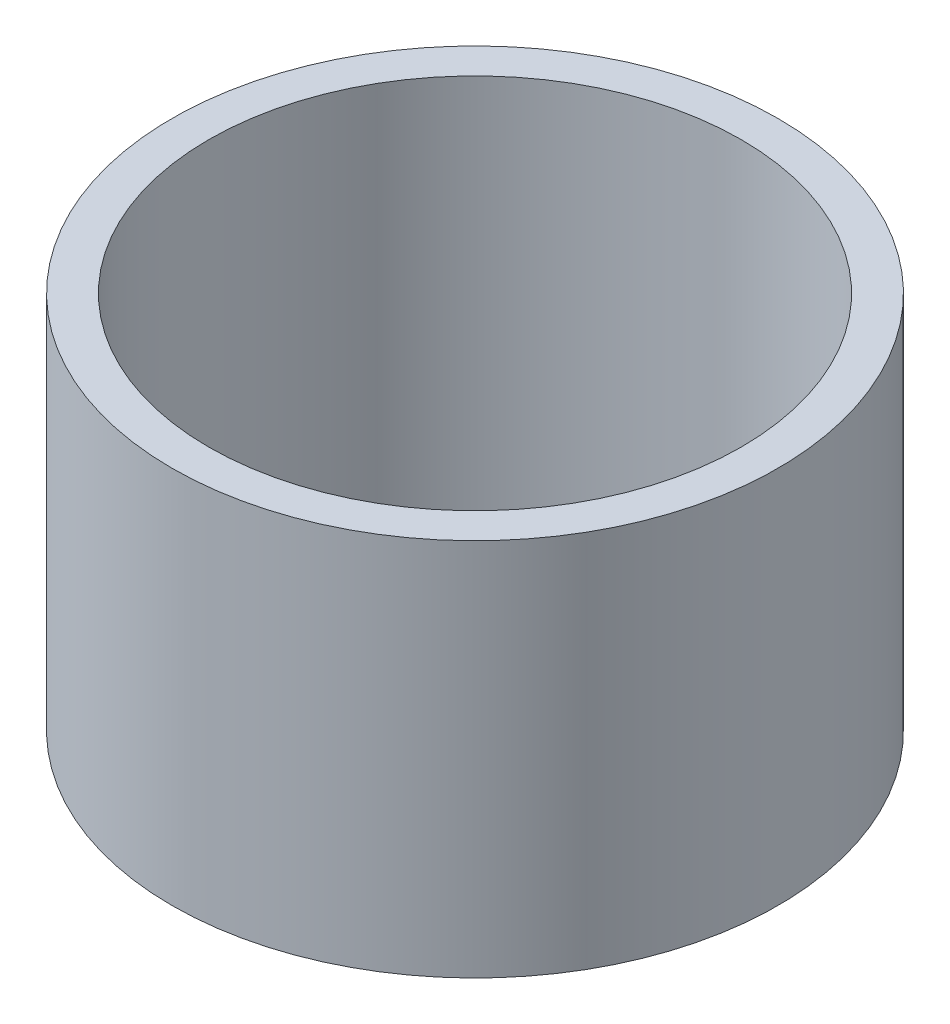
ISO-10303-21;
HEADER;
FILE_DESCRIPTION(('STEP AP214'),'2;1');
FILE_NAME('part.step','',(''),(''),'','','');
FILE_SCHEMA(('AUTOMOTIVE_DESIGN { 1 0 10303 214 1 1 1 1 }'));
ENDSEC;
DATA;
#1=APPLICATION_CONTEXT('core data for automotive mechanical design processes');
#2=APPLICATION_PROTOCOL_DEFINITION('international standard','automotive_design',2000,#1);
#3=PRODUCT_CONTEXT('',#1,'mechanical');
#4=PRODUCT('Part','Part','',(#3));
#5=PRODUCT_RELATED_PRODUCT_CATEGORY('part','',(#4));
#6=PRODUCT_DEFINITION_FORMATION('','',#4);
#7=PRODUCT_DEFINITION_CONTEXT('part definition',#1,'design');
#8=PRODUCT_DEFINITION('design','',#6,#7);
#9=PRODUCT_DEFINITION_SHAPE('','',#8);
#10=(LENGTH_UNIT() NAMED_UNIT(*) SI_UNIT(.MILLI.,.METRE.));
#11=(NAMED_UNIT(*) PLANE_ANGLE_UNIT() SI_UNIT($,.RADIAN.));
#12=(NAMED_UNIT(*) SI_UNIT($,.STERADIAN.) SOLID_ANGLE_UNIT());
#13=UNCERTAINTY_MEASURE_WITH_UNIT(LENGTH_MEASURE(1.E-05),#10,'distance_accuracy_value','');
#14=(GEOMETRIC_REPRESENTATION_CONTEXT(3) GLOBAL_UNCERTAINTY_ASSIGNED_CONTEXT((#13)) GLOBAL_UNIT_ASSIGNED_CONTEXT((#10,
#11,#12)) REPRESENTATION_CONTEXT('',''));
#15=CARTESIAN_POINT('',(0.,0.,0.));
#16=DIRECTION('',(0.,0.,1.));
#17=DIRECTION('',(1.,0.,0.));
#18=AXIS2_PLACEMENT_3D('',#15,#16,#17);
#19=CARTESIAN_POINT('',(0.,16.,0.));
#20=DIRECTION('',(0.,-1.,0.));
#21=DIRECTION('',(0.,0.,-1.));
#22=AXIS2_PLACEMENT_3D('',#19,#20,#21);
#23=CYLINDRICAL_SURFACE('',#22,12.8);
#24=CARTESIAN_POINT('',(0.,16.,0.));
#25=DIRECTION('',(0.,1.,0.));
#26=DIRECTION('',(0.,0.,1.));
#27=AXIS2_PLACEMENT_3D('',#24,#25,#26);
#28=CIRCLE('',#27,12.8);
#29=CARTESIAN_POINT('',(0.,16.,12.8));
#30=VERTEX_POINT('',#29);
#31=EDGE_CURVE('E10',#30,#30,#28,.T.);
#32=ORIENTED_EDGE('',*,*,#31,.F.);
#33=EDGE_LOOP('',(#32));
#34=FACE_BOUND('',#33,.T.);
#35=CARTESIAN_POINT('',(0.,0.,0.));
#36=DIRECTION('',(0.,1.,0.));
#37=DIRECTION('',(0.,0.,1.));
#38=AXIS2_PLACEMENT_3D('',#35,#36,#37);
#39=CIRCLE('',#38,12.8);
#40=CARTESIAN_POINT('',(0.,0.,12.8));
#41=VERTEX_POINT('',#40);
#42=EDGE_CURVE('E40',#41,#41,#39,.T.);
#43=ORIENTED_EDGE('',*,*,#42,.T.);
#44=EDGE_LOOP('',(#43));
#45=FACE_BOUND('',#44,.T.);
#46=ADVANCED_FACE('F37',(#34,#45),#23,.T.);
#47=CARTESIAN_POINT('',(0.,16.,0.));
#48=DIRECTION('',(0.,1.,0.));
#49=DIRECTION('',(0.,0.,1.));
#50=AXIS2_PLACEMENT_3D('',#47,#48,#49);
#51=PLANE('',#50);
#52=CARTESIAN_POINT('',(0.,16.,0.));
#53=DIRECTION('',(0.,1.,0.));
#54=DIRECTION('',(0.,0.,1.));
#55=AXIS2_PLACEMENT_3D('',#52,#53,#54);
#56=CIRCLE('',#55,11.25);
#57=CARTESIAN_POINT('',(0.,16.,11.25));
#58=VERTEX_POINT('',#57);
#59=EDGE_CURVE('E51',#58,#58,#56,.T.);
#60=ORIENTED_EDGE('',*,*,#59,.F.);
#61=EDGE_LOOP('',(#60));
#62=FACE_BOUND('',#61,.T.);
#63=ORIENTED_EDGE('',*,*,#31,.T.);
#64=EDGE_LOOP('',(#63));
#65=FACE_BOUND('',#64,.T.);
#66=ADVANCED_FACE('F68',(#62,#65),#51,.T.);
#67=CARTESIAN_POINT('',(0.,0.,0.));
#68=DIRECTION('',(0.,1.,0.));
#69=DIRECTION('',(0.,0.,1.));
#70=AXIS2_PLACEMENT_3D('',#67,#68,#69);
#71=PLANE('',#70);
#72=CARTESIAN_POINT('',(0.,0.,0.));
#73=DIRECTION('',(0.,1.,0.));
#74=DIRECTION('',(0.,0.,1.));
#75=AXIS2_PLACEMENT_3D('',#72,#73,#74);
#76=CIRCLE('',#75,11.25);
#77=CARTESIAN_POINT('',(0.,0.,11.25));
#78=VERTEX_POINT('',#77);
#79=EDGE_CURVE('E49',#78,#78,#76,.T.);
#80=ORIENTED_EDGE('',*,*,#79,.T.);
#81=EDGE_LOOP('',(#80));
#82=FACE_BOUND('',#81,.T.);
#83=ORIENTED_EDGE('',*,*,#42,.F.);
#84=EDGE_LOOP('',(#83));
#85=FACE_BOUND('',#84,.T.);
#86=ADVANCED_FACE('F59',(#82,#85),#71,.F.);
#87=CARTESIAN_POINT('',(0.,0.,0.));
#88=DIRECTION('',(0.,1.,0.));
#89=DIRECTION('',(0.,0.,1.));
#90=AXIS2_PLACEMENT_3D('',#87,#88,#89);
#91=CYLINDRICAL_SURFACE('',#90,11.25);
#92=ORIENTED_EDGE('',*,*,#79,.F.);
#93=EDGE_LOOP('',(#92));
#94=FACE_BOUND('',#93,.T.);
#95=ORIENTED_EDGE('',*,*,#59,.T.);
#96=EDGE_LOOP('',(#95));
#97=FACE_BOUND('',#96,.T.);
#98=ADVANCED_FACE('F62',(#94,#97),#91,.F.);
#99=CLOSED_SHELL('',(#46,#66,#86,#98));
#100=MANIFOLD_SOLID_BREP('B2',#99);
#101=ADVANCED_BREP_SHAPE_REPRESENTATION('',(#18,#100),#14);
#102=SHAPE_DEFINITION_REPRESENTATION(#9,#101);
ENDSEC;
END-ISO-10303-21;
